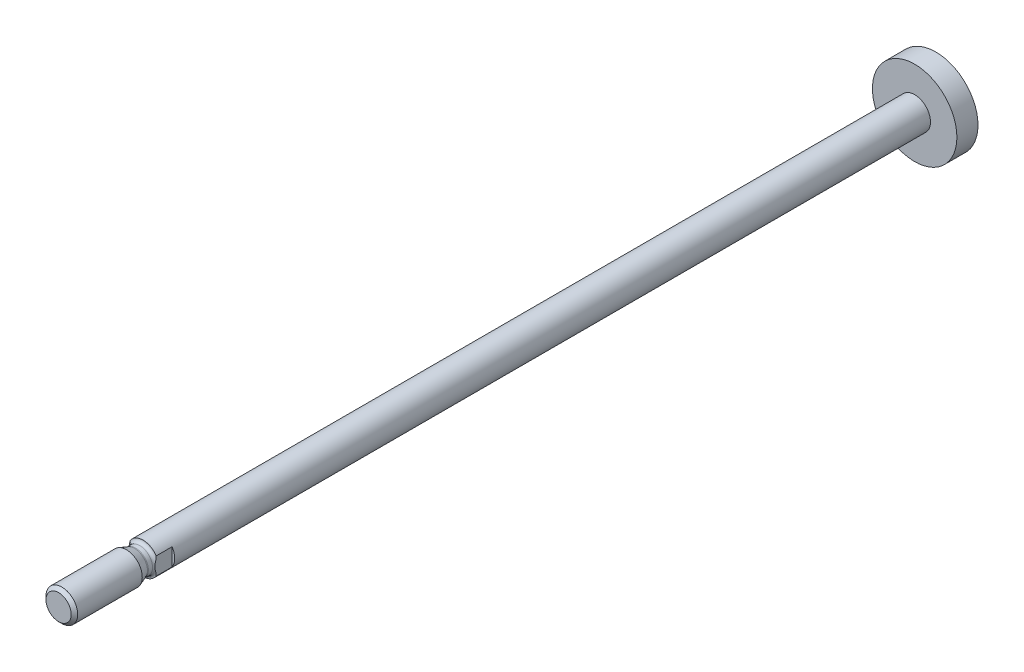
ISO-10303-21;
HEADER;
FILE_DESCRIPTION(('STEP AP214'),'2;1');
FILE_NAME('part.step','',(''),(''),'','','');
FILE_SCHEMA(('AUTOMOTIVE_DESIGN { 1 0 10303 214 1 1 1 1 }'));
ENDSEC;
DATA;
#1=APPLICATION_CONTEXT('core data for automotive mechanical design processes');
#2=APPLICATION_PROTOCOL_DEFINITION('international standard','automotive_design',2000,#1);
#3=PRODUCT_CONTEXT('',#1,'mechanical');
#4=PRODUCT('Part','Part','',(#3));
#5=PRODUCT_RELATED_PRODUCT_CATEGORY('part','',(#4));
#6=PRODUCT_DEFINITION_FORMATION('','',#4);
#7=PRODUCT_DEFINITION_CONTEXT('part definition',#1,'design');
#8=PRODUCT_DEFINITION('design','',#6,#7);
#9=PRODUCT_DEFINITION_SHAPE('','',#8);
#10=(LENGTH_UNIT() NAMED_UNIT(*) SI_UNIT(.MILLI.,.METRE.));
#11=(NAMED_UNIT(*) PLANE_ANGLE_UNIT() SI_UNIT($,.RADIAN.));
#12=(NAMED_UNIT(*) SI_UNIT($,.STERADIAN.) SOLID_ANGLE_UNIT());
#13=UNCERTAINTY_MEASURE_WITH_UNIT(LENGTH_MEASURE(1.E-05),#10,'distance_accuracy_value','');
#14=(GEOMETRIC_REPRESENTATION_CONTEXT(3) GLOBAL_UNCERTAINTY_ASSIGNED_CONTEXT((#13)) GLOBAL_UNIT_ASSIGNED_CONTEXT((#10,
#11,#12)) REPRESENTATION_CONTEXT('',''));
#15=CARTESIAN_POINT('',(0.,0.,0.));
#16=DIRECTION('',(0.,0.,1.));
#17=DIRECTION('',(1.,0.,0.));
#18=AXIS2_PLACEMENT_3D('',#15,#16,#17);
#19=CARTESIAN_POINT('',(0.,0.,-145.2));
#20=DIRECTION('',(0.,0.,1.));
#21=DIRECTION('',(1.,0.,0.));
#22=AXIS2_PLACEMENT_3D('',#19,#20,#21);
#23=CYLINDRICAL_SURFACE('',#22,3.);
#24=CARTESIAN_POINT('',(0.,0.,-141.2));
#25=DIRECTION('',(0.,0.,1.));
#26=DIRECTION('',(1.,0.,0.));
#27=AXIS2_PLACEMENT_3D('',#24,#25,#26);
#28=CIRCLE('',#27,3.);
#29=CARTESIAN_POINT('',(3.,0.,-141.2));
#30=VERTEX_POINT('',#29);
#31=EDGE_CURVE('E125',#30,#30,#28,.T.);
#32=ORIENTED_EDGE('',*,*,#31,.T.);
#33=EDGE_LOOP('',(#32));
#34=FACE_BOUND('',#33,.T.);
#35=DIRECTION('',(0.,0.,1.));
#36=VECTOR('',#35,1.);
#37=CARTESIAN_POINT('',(-2.5,-1.6583123951777,-145.2));
#38=LINE('',#37,#36);
#39=CARTESIAN_POINT('',(-2.5,-1.6583123951777,2.));
#40=VERTEX_POINT('',#39);
#41=CARTESIAN_POINT('',(-2.5,-1.6583123951777,5.));
#42=VERTEX_POINT('',#41);
#43=EDGE_CURVE('E55',#40,#42,#38,.T.);
#44=ORIENTED_EDGE('',*,*,#43,.F.);
#45=CARTESIAN_POINT('',(0.,0.,2.));
#46=DIRECTION('',(0.,0.,1.));
#47=DIRECTION('',(1.,0.,0.));
#48=AXIS2_PLACEMENT_3D('',#45,#46,#47);
#49=CIRCLE('',#48,3.);
#50=CARTESIAN_POINT('',(-2.5,1.6583123951777,2.));
#51=VERTEX_POINT('',#50);
#52=EDGE_CURVE('E11',#51,#40,#49,.T.);
#53=ORIENTED_EDGE('',*,*,#52,.F.);
#54=DIRECTION('',(0.,0.,1.));
#55=VECTOR('',#54,1.);
#56=CARTESIAN_POINT('',(-2.5,1.6583123951777,-145.2));
#57=LINE('',#56,#55);
#58=CARTESIAN_POINT('',(-2.5,1.65831239517778,4.99999999999909));
#59=VERTEX_POINT('',#58);
#60=EDGE_CURVE('E95',#59,#51,#57,.F.);
#61=ORIENTED_EDGE('',*,*,#60,.F.);
#62=CARTESIAN_POINT('',(0.,0.,5.));
#63=DIRECTION('',(0.,0.,1.));
#64=DIRECTION('',(1.,0.,0.));
#65=AXIS2_PLACEMENT_3D('',#62,#63,#64);
#66=CIRCLE('',#65,3.);
#67=CARTESIAN_POINT('',(2.5,1.6583123951777,5.));
#68=VERTEX_POINT('',#67);
#69=EDGE_CURVE('E94',#68,#59,#66,.T.);
#70=ORIENTED_EDGE('',*,*,#69,.F.);
#71=DIRECTION('',(0.,0.,1.));
#72=VECTOR('',#71,1.);
#73=CARTESIAN_POINT('',(2.5,1.6583123951777,-145.2));
#74=LINE('',#73,#72);
#75=CARTESIAN_POINT('',(2.5,1.6583123951777,2.));
#76=VERTEX_POINT('',#75);
#77=EDGE_CURVE('E63',#76,#68,#74,.T.);
#78=ORIENTED_EDGE('',*,*,#77,.F.);
#79=CARTESIAN_POINT('',(2.5,-1.6583123951777,2.));
#80=VERTEX_POINT('',#79);
#81=EDGE_CURVE('E44',#80,#76,#49,.T.);
#82=ORIENTED_EDGE('',*,*,#81,.F.);
#83=DIRECTION('',(0.,0.,1.));
#84=VECTOR('',#83,1.);
#85=CARTESIAN_POINT('',(2.5,-1.6583123951777,-145.2));
#86=LINE('',#85,#84);
#87=CARTESIAN_POINT('',(2.5,-1.65831239517778,4.99999999999909));
#88=VERTEX_POINT('',#87);
#89=EDGE_CURVE('E88',#88,#80,#86,.F.);
#90=ORIENTED_EDGE('',*,*,#89,.F.);
#91=EDGE_CURVE('E128',#42,#88,#66,.T.);
#92=ORIENTED_EDGE('',*,*,#91,.F.);
#93=EDGE_LOOP('',(#44,#53,#61,#70,#78,#82,#90,#92));
#94=FACE_BOUND('',#93,.T.);
#95=ADVANCED_FACE('F41',(#34,#94),#23,.T.);
#96=CARTESIAN_POINT('',(0.,0.,5.6000000000001));
#97=DIRECTION('',(0.,0.,1.));
#98=DIRECTION('',(1.,0.,0.));
#99=AXIS2_PLACEMENT_3D('',#96,#97,#98);
#100=TOROIDAL_SURFACE('',#99,3.0000000000001,0.600000000000099);
#101=CARTESIAN_POINT('',(0.,0.,5.6));
#102=DIRECTION('',(0.,0.,1.));
#103=DIRECTION('',(1.,0.,0.));
#104=AXIS2_PLACEMENT_3D('',#101,#102,#103);
#105=CIRCLE('',#104,2.4);
#106=CARTESIAN_POINT('',(2.4,0.,5.6));
#107=VERTEX_POINT('',#106);
#108=EDGE_CURVE('E116',#107,#107,#105,.T.);
#109=ORIENTED_EDGE('',*,*,#108,.F.);
#110=EDGE_LOOP('',(#109));
#111=FACE_BOUND('',#110,.T.);
#112=CARTESIAN_POINT('',(-2.5,0.,5.26833752096453));
#113=CARTESIAN_POINT('',(-2.5,0.0507234426297441,5.26834839993848));
#114=CARTESIAN_POINT('',(-2.5,0.101441776799662,5.26596843791489));
#115=CARTESIAN_POINT('',(-2.5,0.202536067556288,5.2569952015163));
#116=CARTESIAN_POINT('',(-2.5,0.252911588949165,5.2503973212644));
#117=CARTESIAN_POINT('',(-2.5,0.35392632203634,5.23403658213965));
#118=CARTESIAN_POINT('',(-2.5,0.404557369480025,5.224225913585));
#119=CARTESIAN_POINT('',(-2.5,0.505400398866161,5.20278595137819));
#120=CARTESIAN_POINT('',(-2.5,0.555612509775304,5.1911572409283));
#121=CARTESIAN_POINT('',(-2.5,0.655655613826413,5.16721678219831));
#122=CARTESIAN_POINT('',(-2.5,0.705487327239528,5.15490798008948));
#123=CARTESIAN_POINT('',(-2.5,0.805181864056362,5.13041893752706));
#124=CARTESIAN_POINT('',(-2.5,0.855044688832192,5.11823870324147));
#125=CARTESIAN_POINT('',(-2.5,1.00507376125951,5.08293674920261));
#126=CARTESIAN_POINT('',(-2.5,1.1055660279648,5.06108488117838));
#127=CARTESIAN_POINT('',(-2.5,1.30645493621981,5.02592717471424));
#128=CARTESIAN_POINT('',(-2.5,1.40682678389803,5.01248870030289));
#129=CARTESIAN_POINT('',(-2.5,1.60840199518987,4.99838763017595));
#130=CARTESIAN_POINT('',(-2.5,1.70960094347028,4.99767823287719));
#131=CARTESIAN_POINT('',(-2.5,1.86622781794818,5.01106448653587));
#132=CARTESIAN_POINT('',(-2.5,1.92218137883188,5.01877622049858));
#133=CARTESIAN_POINT('',(-2.5,2.03285053262341,5.0413651074687));
#134=CARTESIAN_POINT('',(-2.5,2.08756307823151,5.05625824117348));
#135=CARTESIAN_POINT('',(-2.5,2.18328084843635,5.09083457513036));
#136=CARTESIAN_POINT('',(-2.5,2.22483950461237,5.10896465354793));
#137=CARTESIAN_POINT('',(-2.5,2.30459524648064,5.1515245306446));
#138=CARTESIAN_POINT('',(-2.5,2.34279989724468,5.17593963670877));
#139=CARTESIAN_POINT('',(-2.5,2.40362753966407,5.22361594487622));
#140=CARTESIAN_POINT('',(-2.5,2.42757076392253,5.24518752529637));
#141=CARTESIAN_POINT('',(-2.5,2.47175757689057,5.29185573262645));
#142=CARTESIAN_POINT('',(-2.5,2.49200531158724,5.31694835263777));
#143=CARTESIAN_POINT('',(-2.5,2.52468492158815,5.36594738678137));
#144=CARTESIAN_POINT('',(-2.5,2.53785643218482,5.38935828111803));
#145=CARTESIAN_POINT('',(-2.5,2.56013164913301,5.43805384411947));
#146=CARTESIAN_POINT('',(-2.5,2.56923737677398,5.46333757440499));
#147=CARTESIAN_POINT('',(-2.5,2.58283057049981,5.51527496834575));
#148=CARTESIAN_POINT('',(-2.5,2.58729356105886,5.54193512227162));
#149=CARTESIAN_POINT('',(-2.5,2.59118020467599,5.59561989324821));
#150=CARTESIAN_POINT('',(-2.5,2.5906054179438,5.62264439487102));
#151=CARTESIAN_POINT('',(-2.5,2.5847447911938,5.67371298536964));
#152=CARTESIAN_POINT('',(-2.5,2.57988467167735,5.69780754958458));
#153=CARTESIAN_POINT('',(-2.5,2.56633022368149,5.74488485425705));
#154=CARTESIAN_POINT('',(-2.5,2.55763543991684,5.76786746233366));
#155=CARTESIAN_POINT('',(-2.5,2.53647695281551,5.81308697753744));
#156=CARTESIAN_POINT('',(-2.5,2.52388217742275,5.83526203314746));
#157=CARTESIAN_POINT('',(-2.5,2.49565831542702,5.87756858678122));
#158=CARTESIAN_POINT('',(-2.5,2.4800283022487,5.897699457906));
#159=CARTESIAN_POINT('',(-2.5,2.4381803160609,5.94494905141413));
#160=CARTESIAN_POINT('',(-2.5,2.41048793322772,5.97076525046522));
#161=CARTESIAN_POINT('',(-2.5,2.35128940318857,6.01762864695372));
#162=CARTESIAN_POINT('',(-2.5,2.31977194494069,6.03866114436212));
#163=CARTESIAN_POINT('',(-2.5,2.23952256294481,6.08463351159361));
#164=CARTESIAN_POINT('',(-2.5,2.18939204577726,6.10711912432076));
#165=CARTESIAN_POINT('',(-2.5,2.086424206848,6.14398267826286));
#166=CARTESIAN_POINT('',(-2.5,2.03358928965091,6.15836768991921));
#167=CARTESIAN_POINT('',(-2.5,1.93599580204544,6.17849484994285));
#168=CARTESIAN_POINT('',(-2.5,1.89144834077192,6.18531116329585));
#169=CARTESIAN_POINT('',(-2.5,1.80189908033616,6.19505697557448));
#170=CARTESIAN_POINT('',(-2.5,1.75689686177072,6.19798247787778));
#171=CARTESIAN_POINT('',(-2.5,1.66646832286127,6.20053377831371));
#172=CARTESIAN_POINT('',(-2.5,1.6210413945456,6.20013412759755));
#173=CARTESIAN_POINT('',(-2.5,1.53034280767568,6.19650595241103));
#174=CARTESIAN_POINT('',(-2.5,1.48507106445849,6.1932793543307));
#175=CARTESIAN_POINT('',(-2.5,1.33918047559004,6.17906735223514));
#176=CARTESIAN_POINT('',(-2.5,1.23902345631669,6.16342028964884));
#177=CARTESIAN_POINT('',(-2.5,1.03994836030368,6.12508984420092));
#178=CARTESIAN_POINT('',(-2.5,0.941034235224376,6.10238806221333));
#179=CARTESIAN_POINT('',(-2.5,0.793509038998567,6.06677672186832));
#180=CARTESIAN_POINT('',(-2.5,0.7446863854637,6.054702575567));
#181=CARTESIAN_POINT('',(-2.5,0.646996290398524,6.030738686552));
#182=CARTESIAN_POINT('',(-2.5,0.598128851070118,6.0188489352388));
#183=CARTESIAN_POINT('',(-2.5,0.500334281886721,5.99617397742217));
#184=CARTESIAN_POINT('',(-2.5,0.451408146263369,5.98538460255591));
#185=CARTESIAN_POINT('',(-2.5,0.353119090508098,5.96594052833405));
#186=CARTESIAN_POINT('',(-2.5,0.303756196305667,5.95728570312374));
#187=CARTESIAN_POINT('',(-2.5,0.204122497966492,5.94328110899502));
#188=CARTESIAN_POINT('',(-2.5,0.153847567097064,5.93795905985694));
#189=CARTESIAN_POINT('',(-2.5,0.0530351286873156,5.93177082830429));
#190=CARTESIAN_POINT('',(-2.5,0.0024977994589948,5.930901937583));
#191=CARTESIAN_POINT('',(-2.5,-0.0985305210715612,5.93381110626722));
#192=CARTESIAN_POINT('',(-2.5,-0.14902123482016,5.93759813511376));
#193=CARTESIAN_POINT('',(-2.5,-0.249573888409545,5.94904126176878));
#194=CARTESIAN_POINT('',(-2.5,-0.299635458091892,5.95670041313862));
#195=CARTESIAN_POINT('',(-2.5,-0.399725252919972,5.97472154484855));
#196=CARTESIAN_POINT('',(-2.5,-0.449748880216866,5.98510788708088));
#197=CARTESIAN_POINT('',(-2.5,-0.549453617514231,6.00732659888942));
#198=CARTESIAN_POINT('',(-2.5,-0.599134785603654,6.01915871651809));
#199=CARTESIAN_POINT('',(-2.5,-0.698392421521691,6.04328051823731));
#200=CARTESIAN_POINT('',(-2.5,-0.747968869022546,6.05557028383309));
#201=CARTESIAN_POINT('',(-2.5,-0.84720464589227,6.07981009984425));
#202=CARTESIAN_POINT('',(-2.5,-0.896863971124109,6.0917601667094));
#203=CARTESIAN_POINT('',(-2.5,-0.975241469303783,6.10978478042876));
#204=CARTESIAN_POINT('',(-2.5,-1.00388150216564,6.11619624816889));
#205=CARTESIAN_POINT('',(-2.5,-1.06125902675178,6.12857195456169));
#206=CARTESIAN_POINT('',(-2.5,-1.08999652018277,6.13453618533974));
#207=CARTESIAN_POINT('',(-2.5,-1.14748265723325,6.1458846074232));
#208=CARTESIAN_POINT('',(-2.5,-1.17623091126653,6.15127075206469));
#209=CARTESIAN_POINT('',(-2.5,-1.23384312688132,6.16137594760793));
#210=CARTESIAN_POINT('',(-2.5,-1.26270708577413,6.16609501391968));
#211=CARTESIAN_POINT('',(-2.5,-1.34949136584038,6.17908804539659));
#212=CARTESIAN_POINT('',(-2.5,-1.40759592627029,6.18619616796949));
#213=CARTESIAN_POINT('',(-2.5,-1.52420669712544,6.19636423685649));
#214=CARTESIAN_POINT('',(-2.5,-1.58271310503325,6.1994220245478));
#215=CARTESIAN_POINT('',(-2.5,-1.70911532678372,6.20051114496721));
#216=CARTESIAN_POINT('',(-2.5,-1.77702602049488,6.19766666103081));
#217=CARTESIAN_POINT('',(-2.5,-1.912149147007,6.18315262249392));
#218=CARTESIAN_POINT('',(-2.5,-1.97936016975703,6.17146782027944));
#219=CARTESIAN_POINT('',(-2.5,-2.09293467910467,6.14162835403314));
#220=CARTESIAN_POINT('',(-2.5,-2.1399801193776,6.12611102431254));
#221=CARTESIAN_POINT('',(-2.5,-2.23116163556241,6.08815370009842));
#222=CARTESIAN_POINT('',(-2.5,-2.27530548479003,6.06573319994486));
#223=CARTESIAN_POINT('',(-2.5,-2.34660579555824,6.0206656653127));
#224=CARTESIAN_POINT('',(-2.5,-2.37498330055351,5.99995880382842));
#225=CARTESIAN_POINT('',(-2.5,-2.42818185419372,5.95435228802646));
#226=CARTESIAN_POINT('',(-2.5,-2.45300628498281,5.92945667074117));
#227=CARTESIAN_POINT('',(-2.5,-2.49337206402375,5.88080957286876));
#228=CARTESIAN_POINT('',(-2.5,-2.50977972671913,5.85778028891266));
#229=CARTESIAN_POINT('',(-2.5,-2.5385948801776,5.80932543735906));
#230=CARTESIAN_POINT('',(-2.5,-2.55100468980703,5.7839012699618));
#231=CARTESIAN_POINT('',(-2.5,-2.57111606880391,5.7310152189761));
#232=CARTESIAN_POINT('',(-2.5,-2.57878240755407,5.70353974708557));
#233=CARTESIAN_POINT('',(-2.5,-2.58865812747843,5.64762323062993));
#234=CARTESIAN_POINT('',(-2.5,-2.59087093912576,5.61918280447873));
#235=CARTESIAN_POINT('',(-2.5,-2.58974032110845,5.56589468768046));
#236=CARTESIAN_POINT('',(-2.5,-2.58704036062141,5.54103102121321));
#237=CARTESIAN_POINT('',(-2.5,-2.57748265423562,5.49212434637714));
#238=CARTESIAN_POINT('',(-2.5,-2.57062518368025,5.46808128377277));
#239=CARTESIAN_POINT('',(-2.5,-2.55318309970271,5.42147694109437));
#240=CARTESIAN_POINT('',(-2.5,-2.54260847384664,5.39891188066154));
#241=CARTESIAN_POINT('',(-2.5,-2.51826231502416,5.35558968714916));
#242=CARTESIAN_POINT('',(-2.5,-2.50448933519591,5.33483337816906));
#243=CARTESIAN_POINT('',(-2.5,-2.46797257111134,5.28708275256527));
#244=CARTESIAN_POINT('',(-2.5,-2.44388663659998,5.26111270404154));
#245=CARTESIAN_POINT('',(-2.5,-2.39183121173732,5.21341702762138));
#246=CARTESIAN_POINT('',(-2.5,-2.36385414462067,5.19169988455002));
#247=CARTESIAN_POINT('',(-2.5,-2.29309604385226,5.14424955817408));
#248=CARTESIAN_POINT('',(-2.5,-2.24896151787955,5.12054273771195));
#249=CARTESIAN_POINT('',(-2.5,-2.15755724893995,5.08032986787273));
#250=CARTESIAN_POINT('',(-2.5,-2.1102815253453,5.0638380357592));
#251=CARTESIAN_POINT('',(-2.5,-1.98539576167196,5.02901994971649));
#252=CARTESIAN_POINT('',(-2.5,-1.90647682078743,5.01544295171964));
#253=CARTESIAN_POINT('',(-2.5,-1.74768813149434,5.00017484346382));
#254=CARTESIAN_POINT('',(-2.5,-1.66781762927049,4.99849388464395));
#255=CARTESIAN_POINT('',(-2.5,-1.45429321635247,5.00579419289827));
#256=CARTESIAN_POINT('',(-2.5,-1.32097329964418,5.02279704607492));
#257=CARTESIAN_POINT('',(-2.5,-1.12273292987174,5.05843900515103));
#258=CARTESIAN_POINT('',(-2.5,-1.05669317759064,5.07208123732001));
#259=CARTESIAN_POINT('',(-2.5,-0.925080173294097,5.10144856377507));
#260=CARTESIAN_POINT('',(-2.5,-0.85950678696237,5.11717303045709));
#261=CARTESIAN_POINT('',(-2.5,-0.728157455724953,5.14928145287764));
#262=CARTESIAN_POINT('',(-2.5,-0.662382356378558,5.16566853749943));
#263=CARTESIAN_POINT('',(-2.5,-0.530451230737349,5.19710748690057));
#264=CARTESIAN_POINT('',(-2.5,-0.46429498692756,5.21215848739435));
#265=CARTESIAN_POINT('',(-2.5,-0.332137198799993,5.23811298682939));
#266=CARTESIAN_POINT('',(-2.5,-0.266147995614798,5.24907485812429));
#267=CARTESIAN_POINT('',(-2.5,-0.13343508853748,5.26417313941374));
#268=CARTESIAN_POINT('',(-2.5,-0.0667131258677896,5.26832321258322));
#269=CARTESIAN_POINT('',(-2.5,0.,5.26833752096453));
#270=B_SPLINE_CURVE_WITH_KNOTS('',3,(#112,#113,#114,#115,#116,#117,#118,#119,#120,#121,#122,
#123,#124,#125,#126,#127,#128,#129,#130,#131,#132,#133,#134,#135,#136,#137,#138,#139,#140,#141,
#142,#143,#144,#145,#146,#147,#148,#149,#150,#151,#152,#153,#154,#155,#156,#157,#158,#159,#160,
#161,#162,#163,#164,#165,#166,#167,#168,#169,#170,#171,#172,#173,#174,#175,#176,#177,#178,#179,
#180,#181,#182,#183,#184,#185,#186,#187,#188,#189,#190,#191,#192,#193,#194,#195,#196,#197,#198,
#199,#200,#201,#202,#203,#204,#205,#206,#207,#208,#209,#210,#211,#212,#213,#214,#215,#216,#217,
#218,#219,#220,#221,#222,#223,#224,#225,#226,#227,#228,#229,#230,#231,#232,#233,#234,#235,#236,
#237,#238,#239,#240,#241,#242,#243,#244,#245,#246,#247,#248,#249,#250,#251,#252,#253,#254,#255,
#256,#257,#258,#259,#260,#261,#262,#263,#264,#265,#266,#267,#268,#269),.UNSPECIFIED.,.T.,.F.,(4,
2,2,2,2,2,2,2,2,2,2,2,2,2,2,2,2,2,2,2,2,2,2,2,2,2,2,2,2,2,2,2,2,2,2,2,2,2,2,2,2,2,2,2,2,2,2,2,2,
2,2,2,2,2,2,2,2,2,2,2,2,2,2,2,2,2,2,2,2,2,2,2,2,2,2,2,2,2,4),(0.,0.152115749462961,
0.304397890479205,0.459057777660119,0.613668153537359,0.76765452052503,0.921648241698668,
1.22999186740174,1.53334327295527,1.83557910296654,2.00468122496769,2.17416139710525,
2.30975526259906,2.44503498191611,2.54138706790922,2.63763038250484,2.71788414225495,
2.79809795959123,2.87873253660465,2.95934214181033,3.03274594433316,3.10615846435156,
3.18237030946167,3.25860545664829,3.37154774885102,3.48483255287211,3.64874326809032,
3.81251069461259,3.94751849926572,4.08266487644991,4.21884653384819,4.35493546397263,
4.65852821936571,4.96291950372185,5.11380283698696,5.2646791123006,5.41496078164642,
5.56523358814694,5.71674021710462,5.86815469233289,6.01986131905259,6.17168776888823,
6.3249195654772,6.47812469716163,6.63135724578266,6.7845823615018,6.87262624262423,
6.9606716735928,7.04840955727845,7.13614541382411,7.31164210225534,7.487232283928,
7.69072100095721,7.89456149389004,8.04275027379228,8.1905243529531,8.29556794817655,
8.40051087855684,8.48500651711341,8.56945305722983,8.65451949621374,8.73953241154295,
8.81419843639983,8.88885951681877,8.96332150589878,9.03781724571823,9.14348655987521,
9.24936459025057,9.39882327642183,9.54857516145059,9.78744806917548,10.0265247936209,
10.4280628477144,10.630387719692,10.8326517473681,11.0360188284461,11.239516519211,
11.439986712254,11.6400543065313),.UNSPECIFIED.);
#271=EDGE_CURVE('E86',#42,#59,#270,.T.);
#272=ORIENTED_EDGE('',*,*,#271,.F.);
#273=ORIENTED_EDGE('',*,*,#91,.T.);
#274=CARTESIAN_POINT('',(2.5,0.,5.26833752096453));
#275=CARTESIAN_POINT('',(2.5,-0.0507234426297441,5.26834839993848));
#276=CARTESIAN_POINT('',(2.5,-0.101441776799662,5.26596843791489));
#277=CARTESIAN_POINT('',(2.5,-0.202536067556288,5.2569952015163));
#278=CARTESIAN_POINT('',(2.5,-0.252911588949165,5.2503973212644));
#279=CARTESIAN_POINT('',(2.5,-0.35392632203634,5.23403658213965));
#280=CARTESIAN_POINT('',(2.5,-0.404557369480025,5.224225913585));
#281=CARTESIAN_POINT('',(2.5,-0.505400398866161,5.20278595137819));
#282=CARTESIAN_POINT('',(2.5,-0.555612509775304,5.1911572409283));
#283=CARTESIAN_POINT('',(2.5,-0.655655613826413,5.16721678219831));
#284=CARTESIAN_POINT('',(2.5,-0.705487327239528,5.15490798008948));
#285=CARTESIAN_POINT('',(2.5,-0.805181864056362,5.13041893752706));
#286=CARTESIAN_POINT('',(2.5,-0.855044688832192,5.11823870324147));
#287=CARTESIAN_POINT('',(2.5,-1.00507376125951,5.08293674920261));
#288=CARTESIAN_POINT('',(2.5,-1.1055660279648,5.06108488117838));
#289=CARTESIAN_POINT('',(2.5,-1.30645493621981,5.02592717471424));
#290=CARTESIAN_POINT('',(2.5,-1.40682678389803,5.01248870030289));
#291=CARTESIAN_POINT('',(2.5,-1.60840199518987,4.99838763017595));
#292=CARTESIAN_POINT('',(2.5,-1.70960094347028,4.99767823287719));
#293=CARTESIAN_POINT('',(2.5,-1.86622781794818,5.01106448653587));
#294=CARTESIAN_POINT('',(2.5,-1.92218137883188,5.01877622049858));
#295=CARTESIAN_POINT('',(2.5,-2.03285053262341,5.0413651074687));
#296=CARTESIAN_POINT('',(2.5,-2.08756307823151,5.05625824117348));
#297=CARTESIAN_POINT('',(2.5,-2.18328084843635,5.09083457513036));
#298=CARTESIAN_POINT('',(2.5,-2.22483950461237,5.10896465354793));
#299=CARTESIAN_POINT('',(2.5,-2.30459524648064,5.1515245306446));
#300=CARTESIAN_POINT('',(2.5,-2.34279989724468,5.17593963670877));
#301=CARTESIAN_POINT('',(2.5,-2.40362753966407,5.22361594487622));
#302=CARTESIAN_POINT('',(2.5,-2.42757076392253,5.24518752529637));
#303=CARTESIAN_POINT('',(2.5,-2.47175757689057,5.29185573262645));
#304=CARTESIAN_POINT('',(2.5,-2.49200531158724,5.31694835263777));
#305=CARTESIAN_POINT('',(2.5,-2.52468492158815,5.36594738678137));
#306=CARTESIAN_POINT('',(2.5,-2.53785643218482,5.38935828111803));
#307=CARTESIAN_POINT('',(2.5,-2.56013164913301,5.43805384411947));
#308=CARTESIAN_POINT('',(2.5,-2.56923737677398,5.46333757440499));
#309=CARTESIAN_POINT('',(2.5,-2.58283057049981,5.51527496834575));
#310=CARTESIAN_POINT('',(2.5,-2.58729356105886,5.54193512227162));
#311=CARTESIAN_POINT('',(2.5,-2.59118020467599,5.59561989324821));
#312=CARTESIAN_POINT('',(2.5,-2.5906054179438,5.62264439487102));
#313=CARTESIAN_POINT('',(2.5,-2.5847447911938,5.67371298536964));
#314=CARTESIAN_POINT('',(2.5,-2.57988467167735,5.69780754958458));
#315=CARTESIAN_POINT('',(2.5,-2.56633022368149,5.74488485425705));
#316=CARTESIAN_POINT('',(2.5,-2.55763543991684,5.76786746233366));
#317=CARTESIAN_POINT('',(2.5,-2.53647695281551,5.81308697753744));
#318=CARTESIAN_POINT('',(2.5,-2.52388217742275,5.83526203314746));
#319=CARTESIAN_POINT('',(2.5,-2.49565831542702,5.87756858678122));
#320=CARTESIAN_POINT('',(2.5,-2.4800283022487,5.897699457906));
#321=CARTESIAN_POINT('',(2.5,-2.4381803160609,5.94494905141413));
#322=CARTESIAN_POINT('',(2.5,-2.41048793322772,5.97076525046522));
#323=CARTESIAN_POINT('',(2.5,-2.35128940318857,6.01762864695372));
#324=CARTESIAN_POINT('',(2.5,-2.31977194494069,6.03866114436212));
#325=CARTESIAN_POINT('',(2.5,-2.23952256294481,6.08463351159361));
#326=CARTESIAN_POINT('',(2.5,-2.18939204577726,6.10711912432076));
#327=CARTESIAN_POINT('',(2.5,-2.086424206848,6.14398267826286));
#328=CARTESIAN_POINT('',(2.5,-2.03358928965091,6.15836768991921));
#329=CARTESIAN_POINT('',(2.5,-1.93599580204544,6.17849484994285));
#330=CARTESIAN_POINT('',(2.5,-1.89144834077192,6.18531116329585));
#331=CARTESIAN_POINT('',(2.5,-1.80189908033616,6.19505697557448));
#332=CARTESIAN_POINT('',(2.5,-1.75689686177072,6.19798247787778));
#333=CARTESIAN_POINT('',(2.5,-1.66646832286127,6.20053377831371));
#334=CARTESIAN_POINT('',(2.5,-1.6210413945456,6.20013412759755));
#335=CARTESIAN_POINT('',(2.5,-1.53034280767568,6.19650595241103));
#336=CARTESIAN_POINT('',(2.5,-1.48507106445849,6.1932793543307));
#337=CARTESIAN_POINT('',(2.5,-1.33918047559004,6.17906735223514));
#338=CARTESIAN_POINT('',(2.5,-1.23902345631669,6.16342028964884));
#339=CARTESIAN_POINT('',(2.5,-1.03994836030368,6.12508984420092));
#340=CARTESIAN_POINT('',(2.5,-0.941034235224376,6.10238806221333));
#341=CARTESIAN_POINT('',(2.5,-0.793509038998567,6.06677672186832));
#342=CARTESIAN_POINT('',(2.5,-0.7446863854637,6.054702575567));
#343=CARTESIAN_POINT('',(2.5,-0.646996290398524,6.030738686552));
#344=CARTESIAN_POINT('',(2.5,-0.598128851070118,6.0188489352388));
#345=CARTESIAN_POINT('',(2.5,-0.500334281886721,5.99617397742217));
#346=CARTESIAN_POINT('',(2.5,-0.451408146263369,5.98538460255591));
#347=CARTESIAN_POINT('',(2.5,-0.353119090508098,5.96594052833405));
#348=CARTESIAN_POINT('',(2.5,-0.303756196305667,5.95728570312374));
#349=CARTESIAN_POINT('',(2.5,-0.204122497966492,5.94328110899502));
#350=CARTESIAN_POINT('',(2.5,-0.153847567097064,5.93795905985694));
#351=CARTESIAN_POINT('',(2.5,-0.0530351286873156,5.93177082830429));
#352=CARTESIAN_POINT('',(2.5,-0.0024977994589948,5.930901937583));
#353=CARTESIAN_POINT('',(2.5,0.0985305210715612,5.93381110626722));
#354=CARTESIAN_POINT('',(2.5,0.14902123482016,5.93759813511376));
#355=CARTESIAN_POINT('',(2.5,0.249573888409545,5.94904126176878));
#356=CARTESIAN_POINT('',(2.5,0.299635458091892,5.95670041313862));
#357=CARTESIAN_POINT('',(2.5,0.399725252919972,5.97472154484855));
#358=CARTESIAN_POINT('',(2.5,0.449748880216866,5.98510788708088));
#359=CARTESIAN_POINT('',(2.5,0.549453617514231,6.00732659888942));
#360=CARTESIAN_POINT('',(2.5,0.599134785603654,6.01915871651809));
#361=CARTESIAN_POINT('',(2.5,0.698392421521691,6.04328051823731));
#362=CARTESIAN_POINT('',(2.5,0.747968869022546,6.05557028383309));
#363=CARTESIAN_POINT('',(2.5,0.84720464589227,6.07981009984425));
#364=CARTESIAN_POINT('',(2.5,0.896863971124109,6.0917601667094));
#365=CARTESIAN_POINT('',(2.5,0.975241469303783,6.10978478042876));
#366=CARTESIAN_POINT('',(2.5,1.00388150216564,6.11619624816889));
#367=CARTESIAN_POINT('',(2.5,1.06125902675178,6.12857195456169));
#368=CARTESIAN_POINT('',(2.5,1.08999652018277,6.13453618533974));
#369=CARTESIAN_POINT('',(2.5,1.14748265723325,6.1458846074232));
#370=CARTESIAN_POINT('',(2.5,1.17623091126653,6.15127075206469));
#371=CARTESIAN_POINT('',(2.5,1.23384312688132,6.16137594760793));
#372=CARTESIAN_POINT('',(2.5,1.26270708577413,6.16609501391968));
#373=CARTESIAN_POINT('',(2.5,1.34949136584038,6.17908804539659));
#374=CARTESIAN_POINT('',(2.5,1.40759592627029,6.18619616796949));
#375=CARTESIAN_POINT('',(2.5,1.52420669712544,6.19636423685649));
#376=CARTESIAN_POINT('',(2.5,1.58271310503325,6.1994220245478));
#377=CARTESIAN_POINT('',(2.5,1.70911532678372,6.20051114496721));
#378=CARTESIAN_POINT('',(2.5,1.77702602049488,6.19766666103081));
#379=CARTESIAN_POINT('',(2.5,1.912149147007,6.18315262249392));
#380=CARTESIAN_POINT('',(2.5,1.97936016975703,6.17146782027944));
#381=CARTESIAN_POINT('',(2.5,2.09293467910467,6.14162835403314));
#382=CARTESIAN_POINT('',(2.5,2.1399801193776,6.12611102431254));
#383=CARTESIAN_POINT('',(2.5,2.23116163556241,6.08815370009842));
#384=CARTESIAN_POINT('',(2.5,2.27530548479003,6.06573319994486));
#385=CARTESIAN_POINT('',(2.5,2.34660579555824,6.0206656653127));
#386=CARTESIAN_POINT('',(2.5,2.37498330055351,5.99995880382842));
#387=CARTESIAN_POINT('',(2.5,2.42818185419372,5.95435228802646));
#388=CARTESIAN_POINT('',(2.5,2.45300628498281,5.92945667074117));
#389=CARTESIAN_POINT('',(2.5,2.49337206402375,5.88080957286876));
#390=CARTESIAN_POINT('',(2.5,2.50977972671913,5.85778028891266));
#391=CARTESIAN_POINT('',(2.5,2.5385948801776,5.80932543735906));
#392=CARTESIAN_POINT('',(2.5,2.55100468980703,5.7839012699618));
#393=CARTESIAN_POINT('',(2.5,2.57111606880391,5.7310152189761));
#394=CARTESIAN_POINT('',(2.5,2.57878240755407,5.70353974708557));
#395=CARTESIAN_POINT('',(2.5,2.58865812747843,5.64762323062993));
#396=CARTESIAN_POINT('',(2.5,2.59087093912576,5.61918280447873));
#397=CARTESIAN_POINT('',(2.5,2.58974032110845,5.56589468768046));
#398=CARTESIAN_POINT('',(2.5,2.58704036062141,5.54103102121321));
#399=CARTESIAN_POINT('',(2.5,2.57748265423562,5.49212434637714));
#400=CARTESIAN_POINT('',(2.5,2.57062518368025,5.46808128377277));
#401=CARTESIAN_POINT('',(2.5,2.55318309970271,5.42147694109437));
#402=CARTESIAN_POINT('',(2.5,2.54260847384664,5.39891188066154));
#403=CARTESIAN_POINT('',(2.5,2.51826231502416,5.35558968714916));
#404=CARTESIAN_POINT('',(2.5,2.50448933519591,5.33483337816906));
#405=CARTESIAN_POINT('',(2.5,2.46797257111134,5.28708275256527));
#406=CARTESIAN_POINT('',(2.5,2.44388663659998,5.26111270404154));
#407=CARTESIAN_POINT('',(2.5,2.39183121173732,5.21341702762138));
#408=CARTESIAN_POINT('',(2.5,2.36385414462067,5.19169988455002));
#409=CARTESIAN_POINT('',(2.5,2.29309604385226,5.14424955817408));
#410=CARTESIAN_POINT('',(2.5,2.24896151787955,5.12054273771195));
#411=CARTESIAN_POINT('',(2.5,2.15755724893995,5.08032986787273));
#412=CARTESIAN_POINT('',(2.5,2.1102815253453,5.0638380357592));
#413=CARTESIAN_POINT('',(2.5,1.98539576167196,5.02901994971649));
#414=CARTESIAN_POINT('',(2.5,1.90647682078743,5.01544295171964));
#415=CARTESIAN_POINT('',(2.5,1.74768813149434,5.00017484346382));
#416=CARTESIAN_POINT('',(2.5,1.66781762927049,4.99849388464395));
#417=CARTESIAN_POINT('',(2.5,1.45429321635247,5.00579419289827));
#418=CARTESIAN_POINT('',(2.5,1.32097329964418,5.02279704607492));
#419=CARTESIAN_POINT('',(2.5,1.12273292987174,5.05843900515103));
#420=CARTESIAN_POINT('',(2.5,1.05669317759064,5.07208123732001));
#421=CARTESIAN_POINT('',(2.5,0.925080173294097,5.10144856377507));
#422=CARTESIAN_POINT('',(2.5,0.85950678696237,5.11717303045709));
#423=CARTESIAN_POINT('',(2.5,0.728157455724953,5.14928145287764));
#424=CARTESIAN_POINT('',(2.5,0.662382356378558,5.16566853749943));
#425=CARTESIAN_POINT('',(2.5,0.530451230737349,5.19710748690057));
#426=CARTESIAN_POINT('',(2.5,0.46429498692756,5.21215848739435));
#427=CARTESIAN_POINT('',(2.5,0.332137198799993,5.23811298682939));
#428=CARTESIAN_POINT('',(2.5,0.266147995614798,5.24907485812429));
#429=CARTESIAN_POINT('',(2.5,0.13343508853748,5.26417313941374));
#430=CARTESIAN_POINT('',(2.5,0.0667131258677896,5.26832321258322));
#431=CARTESIAN_POINT('',(2.5,0.,5.26833752096453));
#432=B_SPLINE_CURVE_WITH_KNOTS('',3,(#274,#275,#276,#277,#278,#279,#280,#281,#282,#283,#284,
#285,#286,#287,#288,#289,#290,#291,#292,#293,#294,#295,#296,#297,#298,#299,#300,#301,#302,#303,
#304,#305,#306,#307,#308,#309,#310,#311,#312,#313,#314,#315,#316,#317,#318,#319,#320,#321,#322,
#323,#324,#325,#326,#327,#328,#329,#330,#331,#332,#333,#334,#335,#336,#337,#338,#339,#340,#341,
#342,#343,#344,#345,#346,#347,#348,#349,#350,#351,#352,#353,#354,#355,#356,#357,#358,#359,#360,
#361,#362,#363,#364,#365,#366,#367,#368,#369,#370,#371,#372,#373,#374,#375,#376,#377,#378,#379,
#380,#381,#382,#383,#384,#385,#386,#387,#388,#389,#390,#391,#392,#393,#394,#395,#396,#397,#398,
#399,#400,#401,#402,#403,#404,#405,#406,#407,#408,#409,#410,#411,#412,#413,#414,#415,#416,#417,
#418,#419,#420,#421,#422,#423,#424,#425,#426,#427,#428,#429,#430,#431),.UNSPECIFIED.,.T.,.F.,(4,
2,2,2,2,2,2,2,2,2,2,2,2,2,2,2,2,2,2,2,2,2,2,2,2,2,2,2,2,2,2,2,2,2,2,2,2,2,2,2,2,2,2,2,2,2,2,2,2,
2,2,2,2,2,2,2,2,2,2,2,2,2,2,2,2,2,2,2,2,2,2,2,2,2,2,2,2,2,4),(0.,0.152115749462961,
0.304397890479205,0.459057777660119,0.613668153537359,0.76765452052503,0.921648241698668,
1.22999186740174,1.53334327295527,1.83557910296654,2.00468122496769,2.17416139710525,
2.30975526259906,2.44503498191611,2.54138706790922,2.63763038250484,2.71788414225495,
2.79809795959123,2.87873253660465,2.95934214181033,3.03274594433316,3.10615846435156,
3.18237030946167,3.25860545664829,3.37154774885102,3.48483255287211,3.64874326809032,
3.81251069461259,3.94751849926572,4.08266487644991,4.21884653384819,4.35493546397263,
4.65852821936571,4.96291950372185,5.11380283698696,5.2646791123006,5.41496078164642,
5.56523358814694,5.71674021710462,5.86815469233289,6.01986131905259,6.17168776888823,
6.3249195654772,6.47812469716163,6.63135724578266,6.7845823615018,6.87262624262423,
6.9606716735928,7.04840955727845,7.13614541382411,7.31164210225534,7.487232283928,
7.69072100095721,7.89456149389004,8.04275027379228,8.1905243529531,8.29556794817655,
8.40051087855684,8.48500651711341,8.56945305722983,8.65451949621374,8.73953241154295,
8.81419843639983,8.88885951681877,8.96332150589878,9.03781724571823,9.14348655987521,
9.24936459025057,9.39882327642183,9.54857516145059,9.78744806917548,10.0265247936209,
10.4280628477144,10.630387719692,10.8326517473681,11.0360188284461,11.239516519211,
11.439986712254,11.6400543065313),.UNSPECIFIED.);
#433=EDGE_CURVE('E130',#68,#88,#432,.T.);
#434=ORIENTED_EDGE('',*,*,#433,.F.);
#435=ORIENTED_EDGE('',*,*,#69,.T.);
#436=EDGE_LOOP('',(#272,#273,#434,#435));
#437=FACE_BOUND('',#436,.T.);
#438=ADVANCED_FACE('F140',(#111,#437),#100,.F.);
#439=CARTESIAN_POINT('',(0.,3.,-141.2));
#440=DIRECTION('',(0.,0.,-1.));
#441=DIRECTION('',(-1.,0.,0.));
#442=AXIS2_PLACEMENT_3D('',#439,#440,#441);
#443=PLANE('',#442);
#444=ORIENTED_EDGE('',*,*,#31,.F.);
#445=EDGE_LOOP('',(#444));
#446=FACE_BOUND('',#445,.T.);
#447=CARTESIAN_POINT('',(0.,0.,-141.2));
#448=DIRECTION('',(0.,0.,1.));
#449=DIRECTION('',(1.,0.,0.));
#450=AXIS2_PLACEMENT_3D('',#447,#448,#449);
#451=CIRCLE('',#450,8.);
#452=CARTESIAN_POINT('',(8.,0.,-141.2));
#453=VERTEX_POINT('',#452);
#454=EDGE_CURVE('E122',#453,#453,#451,.T.);
#455=ORIENTED_EDGE('',*,*,#454,.T.);
#456=EDGE_LOOP('',(#455));
#457=FACE_BOUND('',#456,.T.);
#458=ADVANCED_FACE('F187',(#446,#457),#443,.F.);
#459=CARTESIAN_POINT('',(0.,0.,-145.2));
#460=DIRECTION('',(0.,0.,1.));
#461=DIRECTION('',(1.,0.,0.));
#462=AXIS2_PLACEMENT_3D('',#459,#460,#461);
#463=CYLINDRICAL_SURFACE('',#462,8.);
#464=ORIENTED_EDGE('',*,*,#454,.F.);
#465=EDGE_LOOP('',(#464));
#466=FACE_BOUND('',#465,.T.);
#467=CARTESIAN_POINT('',(0.,0.,-145.2));
#468=DIRECTION('',(0.,0.,1.));
#469=DIRECTION('',(1.,0.,0.));
#470=AXIS2_PLACEMENT_3D('',#467,#468,#469);
#471=CIRCLE('',#470,8.);
#472=CARTESIAN_POINT('',(8.,0.,-145.2));
#473=VERTEX_POINT('',#472);
#474=EDGE_CURVE('E119',#473,#473,#471,.T.);
#475=ORIENTED_EDGE('',*,*,#474,.T.);
#476=EDGE_LOOP('',(#475));
#477=FACE_BOUND('',#476,.T.);
#478=ADVANCED_FACE('F178',(#466,#477),#463,.T.);
#479=CARTESIAN_POINT('',(0.,8.,-145.2));
#480=DIRECTION('',(0.,0.,1.));
#481=DIRECTION('',(1.,0.,0.));
#482=AXIS2_PLACEMENT_3D('',#479,#480,#481);
#483=PLANE('',#482);
#484=ORIENTED_EDGE('',*,*,#474,.F.);
#485=EDGE_LOOP('',(#484));
#486=FACE_BOUND('',#485,.T.);
#487=ADVANCED_FACE('F173',(#486),#483,.F.);
#488=CARTESIAN_POINT('',(0.,0.,4.));
#489=DIRECTION('',(0.,0.,1.));
#490=DIRECTION('',(1.,0.,0.));
#491=AXIS2_PLACEMENT_3D('',#488,#489,#490);
#492=CYLINDRICAL_SURFACE('',#491,2.4);
#493=CARTESIAN_POINT('',(0.,0.,6.3942038115749));
#494=DIRECTION('',(0.,0.,1.));
#495=DIRECTION('',(1.,0.,0.));
#496=AXIS2_PLACEMENT_3D('',#493,#494,#495);
#497=CIRCLE('',#496,2.4);
#498=CARTESIAN_POINT('',(2.4,0.,6.3942038115749));
#499=VERTEX_POINT('',#498);
#500=EDGE_CURVE('E113',#499,#499,#497,.T.);
#501=ORIENTED_EDGE('',*,*,#500,.F.);
#502=EDGE_LOOP('',(#501));
#503=FACE_BOUND('',#502,.T.);
#504=ORIENTED_EDGE('',*,*,#108,.T.);
#505=EDGE_LOOP('',(#504));
#506=FACE_BOUND('',#505,.T.);
#507=ADVANCED_FACE('F170',(#503,#506),#492,.T.);
#508=CARTESIAN_POINT('',(0.,0.,6.39420381157482));
#509=DIRECTION('',(0.,0.,1.));
#510=DIRECTION('',(1.,0.,0.));
#511=AXIS2_PLACEMENT_3D('',#508,#509,#510);
#512=TOROIDAL_SURFACE('',#511,2.99999999999972,0.599999999999719);
#513=CARTESIAN_POINT('',(0.,0.,6.5994158975703));
#514=DIRECTION('',(0.,0.,1.));
#515=DIRECTION('',(1.,0.,0.));
#516=AXIS2_PLACEMENT_3D('',#513,#514,#515);
#517=CIRCLE('',#516,2.4361844275285);
#518=CARTESIAN_POINT('',(2.4361844275285,0.,6.5994158975703));
#519=VERTEX_POINT('',#518);
#520=EDGE_CURVE('E110',#519,#519,#517,.T.);
#521=ORIENTED_EDGE('',*,*,#520,.F.);
#522=EDGE_LOOP('',(#521));
#523=FACE_BOUND('',#522,.T.);
#524=ORIENTED_EDGE('',*,*,#500,.T.);
#525=EDGE_LOOP('',(#524));
#526=FACE_BOUND('',#525,.T.);
#527=ADVANCED_FACE('F167',(#523,#526),#512,.F.);
#528=CARTESIAN_POINT('',(0.,0.,6.5994158975703));
#529=DIRECTION('',(0.,0.,1.));
#530=DIRECTION('',(1.,0.,0.));
#531=AXIS2_PLACEMENT_3D('',#528,#529,#530);
#532=CONICAL_SURFACE('',#531,2.4361844275285,0.34906585039883);
#533=CARTESIAN_POINT('',(0.,0.,8.1484864516728));
#534=DIRECTION('',(0.,0.,1.));
#535=DIRECTION('',(1.,0.,0.));
#536=AXIS2_PLACEMENT_3D('',#533,#534,#535);
#537=CIRCLE('',#536,3.);
#538=CARTESIAN_POINT('',(3.,0.,8.1484864516728));
#539=VERTEX_POINT('',#538);
#540=EDGE_CURVE('E107',#539,#539,#537,.T.);
#541=ORIENTED_EDGE('',*,*,#540,.F.);
#542=EDGE_LOOP('',(#541));
#543=FACE_BOUND('',#542,.T.);
#544=ORIENTED_EDGE('',*,*,#520,.T.);
#545=EDGE_LOOP('',(#544));
#546=FACE_BOUND('',#545,.T.);
#547=ADVANCED_FACE('F163',(#543,#546),#532,.T.);
#548=CARTESIAN_POINT('',(0.,0.,4.));
#549=DIRECTION('',(0.,0.,1.));
#550=DIRECTION('',(1.,0.,0.));
#551=AXIS2_PLACEMENT_3D('',#548,#549,#550);
#552=CYLINDRICAL_SURFACE('',#551,3.);
#553=CARTESIAN_POINT('',(0.,0.,20.3865));
#554=DIRECTION('',(0.,0.,1.));
#555=DIRECTION('',(1.,0.,0.));
#556=AXIS2_PLACEMENT_3D('',#553,#554,#555);
#557=CIRCLE('',#556,3.);
#558=CARTESIAN_POINT('',(3.,0.,20.3865));
#559=VERTEX_POINT('',#558);
#560=EDGE_CURVE('E104',#559,#559,#557,.T.);
#561=ORIENTED_EDGE('',*,*,#560,.F.);
#562=EDGE_LOOP('',(#561));
#563=FACE_BOUND('',#562,.T.);
#564=ORIENTED_EDGE('',*,*,#540,.T.);
#565=EDGE_LOOP('',(#564));
#566=FACE_BOUND('',#565,.T.);
#567=ADVANCED_FACE('F159',(#563,#566),#552,.T.);
#568=CARTESIAN_POINT('',(0.,0.,20.3865));
#569=DIRECTION('',(0.,0.,-1.));
#570=DIRECTION('',(-1.,0.,0.));
#571=AXIS2_PLACEMENT_3D('',#568,#569,#570);
#572=CONICAL_SURFACE('',#571,3.,0.785398163397449);
#573=CARTESIAN_POINT('',(0.,0.,21.));
#574=DIRECTION('',(0.,0.,1.));
#575=DIRECTION('',(1.,0.,0.));
#576=AXIS2_PLACEMENT_3D('',#573,#574,#575);
#577=CIRCLE('',#576,2.3865);
#578=CARTESIAN_POINT('',(2.3865,0.,21.));
#579=VERTEX_POINT('',#578);
#580=EDGE_CURVE('E101',#579,#579,#577,.T.);
#581=ORIENTED_EDGE('',*,*,#580,.F.);
#582=EDGE_LOOP('',(#581));
#583=FACE_BOUND('',#582,.T.);
#584=ORIENTED_EDGE('',*,*,#560,.T.);
#585=EDGE_LOOP('',(#584));
#586=FACE_BOUND('',#585,.T.);
#587=ADVANCED_FACE('F155',(#583,#586),#572,.T.);
#588=CARTESIAN_POINT('',(0.,0.,21.));
#589=DIRECTION('',(0.,0.,-1.));
#590=DIRECTION('',(-1.,0.,0.));
#591=AXIS2_PLACEMENT_3D('',#588,#589,#590);
#592=PLANE('',#591);
#593=ORIENTED_EDGE('',*,*,#580,.T.);
#594=EDGE_LOOP('',(#593));
#595=FACE_BOUND('',#594,.T.);
#596=ADVANCED_FACE('F147',(#595),#592,.F.);
#597=CARTESIAN_POINT('',(2.5,5.,6.));
#598=DIRECTION('',(1.,0.,0.));
#599=DIRECTION('',(0.,0.,-1.));
#600=AXIS2_PLACEMENT_3D('',#597,#598,#599);
#601=PLANE('',#600);
#602=ORIENTED_EDGE('',*,*,#77,.T.);
#603=ORIENTED_EDGE('',*,*,#433,.T.);
#604=ORIENTED_EDGE('',*,*,#89,.T.);
#605=DIRECTION('',(0.,-1.,0.));
#606=VECTOR('',#605,1.);
#607=CARTESIAN_POINT('',(2.5,5.,2.));
#608=LINE('',#607,#606);
#609=EDGE_CURVE('E83',#76,#80,#608,.T.);
#610=ORIENTED_EDGE('',*,*,#609,.F.);
#611=EDGE_LOOP('',(#602,#603,#604,#610));
#612=FACE_BOUND('',#611,.T.);
#613=ADVANCED_FACE('F87',(#612),#601,.T.);
#614=CARTESIAN_POINT('',(0.,0.,2.));
#615=DIRECTION('',(0.,0.,1.));
#616=DIRECTION('',(1.,0.,0.));
#617=AXIS2_PLACEMENT_3D('',#614,#615,#616);
#618=PLANE('',#617);
#619=ORIENTED_EDGE('',*,*,#81,.T.);
#620=ORIENTED_EDGE('',*,*,#609,.T.);
#621=EDGE_LOOP('',(#619,#620));
#622=FACE_BOUND('',#621,.T.);
#623=ADVANCED_FACE('F82',(#622),#618,.T.);
#624=ORIENTED_EDGE('',*,*,#52,.T.);
#625=DIRECTION('',(0.,1.,0.));
#626=VECTOR('',#625,1.);
#627=CARTESIAN_POINT('',(-2.5,-5.,2.));
#628=LINE('',#627,#626);
#629=EDGE_CURVE('E89',#40,#51,#628,.T.);
#630=ORIENTED_EDGE('',*,*,#629,.T.);
#631=EDGE_LOOP('',(#624,#630));
#632=FACE_BOUND('',#631,.T.);
#633=ADVANCED_FACE('F148',(#632),#618,.T.);
#634=CARTESIAN_POINT('',(-2.5,-5.,6.));
#635=DIRECTION('',(-1.,0.,0.));
#636=DIRECTION('',(0.,0.,1.));
#637=AXIS2_PLACEMENT_3D('',#634,#635,#636);
#638=PLANE('',#637);
#639=ORIENTED_EDGE('',*,*,#43,.T.);
#640=ORIENTED_EDGE('',*,*,#271,.T.);
#641=ORIENTED_EDGE('',*,*,#60,.T.);
#642=ORIENTED_EDGE('',*,*,#629,.F.);
#643=EDGE_LOOP('',(#639,#640,#641,#642));
#644=FACE_BOUND('',#643,.T.);
#645=ADVANCED_FACE('F149',(#644),#638,.T.);
#646=CLOSED_SHELL('',(#95,#438,#458,#478,#487,#507,#527,#547,#567,#587,#596,#613,#623,#633,#645));
#647=MANIFOLD_SOLID_BREP('B2',#646);
#648=ADVANCED_BREP_SHAPE_REPRESENTATION('',(#18,#647),#14);
#649=SHAPE_DEFINITION_REPRESENTATION(#9,#648);
ENDSEC;
END-ISO-10303-21;
